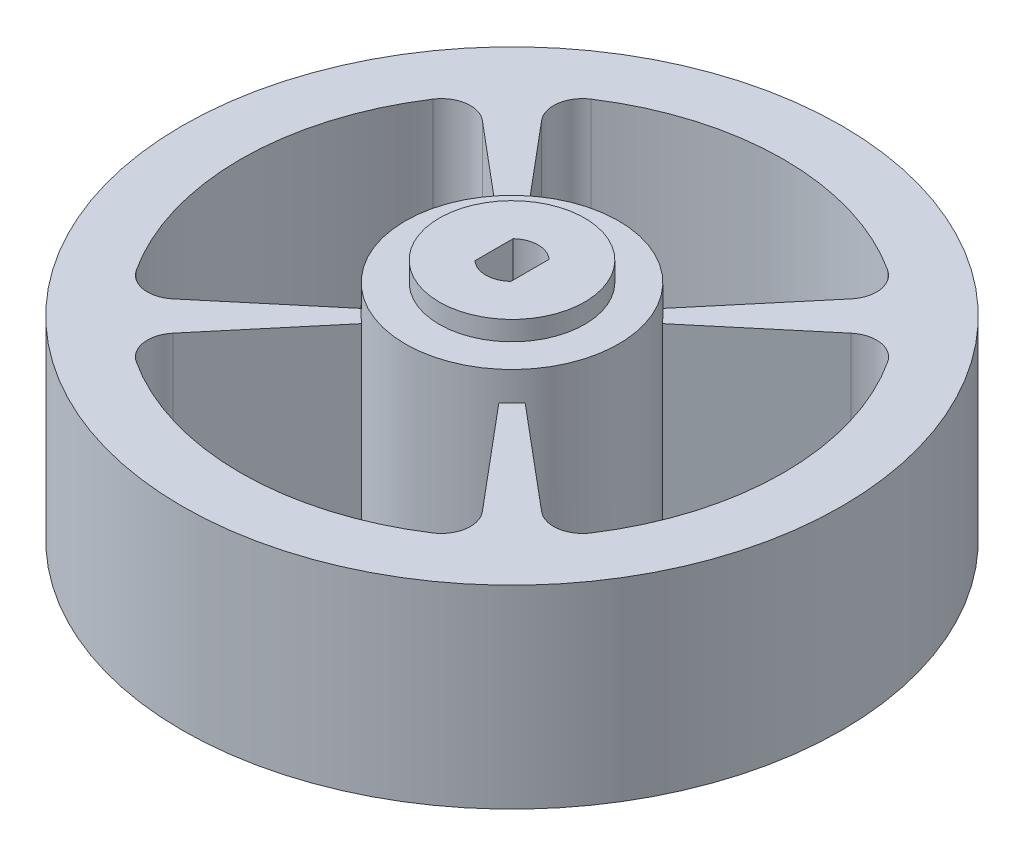
ISO-10303-21;
HEADER;
FILE_DESCRIPTION(('STEP AP214'),'2;1');
FILE_NAME('part.step','',(''),(''),'','','');
FILE_SCHEMA(('AUTOMOTIVE_DESIGN { 1 0 10303 214 1 1 1 1 }'));
ENDSEC;
DATA;
#1=APPLICATION_CONTEXT('core data for automotive mechanical design processes');
#2=APPLICATION_PROTOCOL_DEFINITION('international standard','automotive_design',2000,#1);
#3=PRODUCT_CONTEXT('',#1,'mechanical');
#4=PRODUCT('Part','Part','',(#3));
#5=PRODUCT_RELATED_PRODUCT_CATEGORY('part','',(#4));
#6=PRODUCT_DEFINITION_FORMATION('','',#4);
#7=PRODUCT_DEFINITION_CONTEXT('part definition',#1,'design');
#8=PRODUCT_DEFINITION('design','',#6,#7);
#9=PRODUCT_DEFINITION_SHAPE('','',#8);
#10=(LENGTH_UNIT() NAMED_UNIT(*) SI_UNIT(.MILLI.,.METRE.));
#11=(NAMED_UNIT(*) PLANE_ANGLE_UNIT() SI_UNIT($,.RADIAN.));
#12=(NAMED_UNIT(*) SI_UNIT($,.STERADIAN.) SOLID_ANGLE_UNIT());
#13=UNCERTAINTY_MEASURE_WITH_UNIT(LENGTH_MEASURE(1.E-05),#10,'distance_accuracy_value','');
#14=(GEOMETRIC_REPRESENTATION_CONTEXT(3) GLOBAL_UNCERTAINTY_ASSIGNED_CONTEXT((#13)) GLOBAL_UNIT_ASSIGNED_CONTEXT((#10,
#11,#12)) REPRESENTATION_CONTEXT('',''));
#15=CARTESIAN_POINT('',(0.,0.,0.));
#16=DIRECTION('',(0.,0.,1.));
#17=DIRECTION('',(1.,0.,0.));
#18=AXIS2_PLACEMENT_3D('',#15,#16,#17);
#19=CARTESIAN_POINT('',(0.,10.,0.));
#20=DIRECTION('',(0.,-1.,0.));
#21=DIRECTION('',(0.,0.,-1.));
#22=AXIS2_PLACEMENT_3D('',#19,#20,#21);
#23=CYLINDRICAL_SURFACE('',#22,34.);
#24=CARTESIAN_POINT('',(0.,10.,0.));
#25=DIRECTION('',(0.,1.,0.));
#26=DIRECTION('',(0.,0.,1.));
#27=AXIS2_PLACEMENT_3D('',#24,#25,#26);
#28=CIRCLE('',#27,34.);
#29=CARTESIAN_POINT('',(0.,10.,34.));
#30=VERTEX_POINT('',#29);
#31=EDGE_CURVE('E11',#30,#30,#28,.T.);
#32=ORIENTED_EDGE('',*,*,#31,.F.);
#33=EDGE_LOOP('',(#32));
#34=FACE_BOUND('',#33,.T.);
#35=CARTESIAN_POINT('',(0.,-10.,0.));
#36=DIRECTION('',(0.,1.,0.));
#37=DIRECTION('',(0.,0.,1.));
#38=AXIS2_PLACEMENT_3D('',#35,#36,#37);
#39=CIRCLE('',#38,34.);
#40=CARTESIAN_POINT('',(0.,-10.,34.));
#41=VERTEX_POINT('',#40);
#42=EDGE_CURVE('E44',#41,#41,#39,.T.);
#43=ORIENTED_EDGE('',*,*,#42,.T.);
#44=EDGE_LOOP('',(#43));
#45=FACE_BOUND('',#44,.T.);
#46=ADVANCED_FACE('F41',(#34,#45),#23,.T.);
#47=CARTESIAN_POINT('',(0.,10.,0.));
#48=DIRECTION('',(0.,1.,0.));
#49=DIRECTION('',(0.,0.,1.));
#50=AXIS2_PLACEMENT_3D('',#47,#48,#49);
#51=PLANE('',#50);
#52=DIRECTION('',(-0.642787609686536,0.,-0.766044443118981));
#53=VECTOR('',#52,1.);
#54=CARTESIAN_POINT('',(7.07066370655189,10.,8.42648887430879));
#55=LINE('',#54,#53);
#56=CARTESIAN_POINT('',(15.9535689197929,10.,19.0127230748627));
#57=VERTEX_POINT('',#56);
#58=CARTESIAN_POINT('',(7.07066370655189,10.,8.42648887430879));
#59=VERTEX_POINT('',#58);
#60=EDGE_CURVE('E294',#57,#59,#55,.T.);
#61=ORIENTED_EDGE('',*,*,#60,.F.);
#62=CARTESIAN_POINT('',(13.655435590436,10.,20.9410859039223));
#63=DIRECTION('',(0.,1.,0.));
#64=DIRECTION('',(0.,0.,-1.));
#65=AXIS2_PLACEMENT_3D('',#62,#63,#64);
#66=CIRCLE('',#65,3.);
#67=CARTESIAN_POINT('',(15.2940878612883,10.,23.454016212393));
#68=VERTEX_POINT('',#67);
#69=EDGE_CURVE('E296',#68,#57,#66,.T.);
#70=ORIENTED_EDGE('',*,*,#69,.F.);
#71=CARTESIAN_POINT('',(0.,10.,0.));
#72=DIRECTION('',(0.,1.,0.));
#73=DIRECTION('',(0.,0.,1.));
#74=AXIS2_PLACEMENT_3D('',#71,#72,#73);
#75=CIRCLE('',#74,28.);
#76=CARTESIAN_POINT('',(-15.2940878612886,10.,23.4540162123928));
#77=VERTEX_POINT('',#76);
#78=EDGE_CURVE('E300',#77,#68,#75,.T.);
#79=ORIENTED_EDGE('',*,*,#78,.F.);
#80=CARTESIAN_POINT('',(-13.6554355904363,10.,20.9410859039222));
#81=DIRECTION('',(0.,1.,0.));
#82=DIRECTION('',(0.,0.,1.));
#83=AXIS2_PLACEMENT_3D('',#80,#81,#82);
#84=CIRCLE('',#83,3.);
#85=CARTESIAN_POINT('',(-15.9535689197932,10.,19.0127230748625));
#86=VERTEX_POINT('',#85);
#87=EDGE_CURVE('E303',#86,#77,#84,.T.);
#88=ORIENTED_EDGE('',*,*,#87,.F.);
#89=DIRECTION('',(-0.642787609686546,0.,0.766044443118973));
#90=VECTOR('',#89,1.);
#91=CARTESIAN_POINT('',(-7.070663706552,10.,8.4264888743087));
#92=LINE('',#91,#90);
#93=CARTESIAN_POINT('',(-7.070663706552,10.,8.4264888743087));
#94=VERTEX_POINT('',#93);
#95=EDGE_CURVE('E306',#94,#86,#92,.T.);
#96=ORIENTED_EDGE('',*,*,#95,.F.);
#97=CARTESIAN_POINT('',(0.,10.,0.));
#98=DIRECTION('',(0.,1.,0.));
#99=DIRECTION('',(0.,0.,1.));
#100=AXIS2_PLACEMENT_3D('',#97,#98,#99);
#101=CIRCLE('',#100,11.);
#102=CARTESIAN_POINT('',(-8.42648887430882,10.,7.07066370655186));
#103=VERTEX_POINT('',#102);
#104=EDGE_CURVE('E253',#103,#94,#101,.T.);
#105=ORIENTED_EDGE('',*,*,#104,.F.);
#106=DIRECTION('',(0.766044443118983,0.,-0.642787609686533));
#107=VECTOR('',#106,1.);
#108=CARTESIAN_POINT('',(-8.42648887430882,10.,7.07066370655186));
#109=LINE('',#108,#107);
#110=CARTESIAN_POINT('',(-19.0127230748628,10.,15.9535689197929));
#111=VERTEX_POINT('',#110);
#112=EDGE_CURVE('E229',#111,#103,#109,.T.);
#113=ORIENTED_EDGE('',*,*,#112,.F.);
#114=CARTESIAN_POINT('',(-20.9410859039224,10.,13.6554355904359));
#115=DIRECTION('',(0.,1.,0.));
#116=DIRECTION('',(0.,0.,-1.));
#117=AXIS2_PLACEMENT_3D('',#114,#115,#116);
#118=CIRCLE('',#117,3.);
#119=CARTESIAN_POINT('',(-23.4540162123931,10.,15.2940878612882));
#120=VERTEX_POINT('',#119);
#121=EDGE_CURVE('E240',#120,#111,#118,.T.);
#122=ORIENTED_EDGE('',*,*,#121,.F.);
#123=CARTESIAN_POINT('',(0.,10.,0.));
#124=DIRECTION('',(0.,1.,0.));
#125=DIRECTION('',(0.,0.,1.));
#126=AXIS2_PLACEMENT_3D('',#123,#124,#125);
#127=CIRCLE('',#126,28.);
#128=CARTESIAN_POINT('',(-23.4540162123928,10.,-15.2940878612887));
#129=VERTEX_POINT('',#128);
#130=EDGE_CURVE('E245',#129,#120,#127,.T.);
#131=ORIENTED_EDGE('',*,*,#130,.F.);
#132=CARTESIAN_POINT('',(-20.9410859039221,10.,-13.6554355904363));
#133=DIRECTION('',(0.,1.,0.));
#134=DIRECTION('',(0.,0.,1.));
#135=AXIS2_PLACEMENT_3D('',#132,#133,#134);
#136=CIRCLE('',#135,3.);
#137=CARTESIAN_POINT('',(-19.0127230748625,10.,-15.9535689197932));
#138=VERTEX_POINT('',#137);
#139=EDGE_CURVE('E262',#138,#129,#136,.T.);
#140=ORIENTED_EDGE('',*,*,#139,.F.);
#141=DIRECTION('',(-0.76604444311897,0.,-0.642787609686548));
#142=VECTOR('',#141,1.);
#143=CARTESIAN_POINT('',(-8.42648887430867,10.,-7.07066370655203));
#144=LINE('',#143,#142);
#145=CARTESIAN_POINT('',(-8.42648887430867,10.,-7.07066370655203));
#146=VERTEX_POINT('',#145);
#147=EDGE_CURVE('E265',#146,#138,#144,.T.);
#148=ORIENTED_EDGE('',*,*,#147,.F.);
#149=CARTESIAN_POINT('',(-7.07066370655195,10.,-8.42648887430874));
#150=VERTEX_POINT('',#149);
#151=EDGE_CURVE('E454',#150,#146,#101,.T.);
#152=ORIENTED_EDGE('',*,*,#151,.F.);
#153=DIRECTION('',(0.642787609686541,0.,0.766044443118977));
#154=VECTOR('',#153,1.);
#155=CARTESIAN_POINT('',(-7.07066370655195,10.,-8.42648887430874));
#156=LINE('',#155,#154);
#157=CARTESIAN_POINT('',(-15.9535689197931,10.,-19.0127230748626));
#158=VERTEX_POINT('',#157);
#159=EDGE_CURVE('E371',#158,#150,#156,.T.);
#160=ORIENTED_EDGE('',*,*,#159,.F.);
#161=CARTESIAN_POINT('',(-13.6554355904361,10.,-20.9410859039222));
#162=DIRECTION('',(0.,1.,0.));
#163=DIRECTION('',(0.,0.,-1.));
#164=AXIS2_PLACEMENT_3D('',#161,#162,#163);
#165=CIRCLE('',#164,3.);
#166=CARTESIAN_POINT('',(-15.2940878612885,10.,-23.4540162123929));
#167=VERTEX_POINT('',#166);
#168=EDGE_CURVE('E395',#167,#158,#165,.T.);
#169=ORIENTED_EDGE('',*,*,#168,.F.);
#170=CARTESIAN_POINT('',(0.,10.,0.));
#171=DIRECTION('',(0.,1.,0.));
#172=DIRECTION('',(0.,0.,1.));
#173=AXIS2_PLACEMENT_3D('',#170,#171,#172);
#174=CIRCLE('',#173,28.);
#175=CARTESIAN_POINT('',(15.2940878612884,10.,-23.4540162123929));
#176=VERTEX_POINT('',#175);
#177=EDGE_CURVE('E392',#176,#167,#174,.T.);
#178=ORIENTED_EDGE('',*,*,#177,.F.);
#179=CARTESIAN_POINT('',(13.6554355904361,10.,-20.9410859039222));
#180=DIRECTION('',(0.,1.,0.));
#181=DIRECTION('',(0.,0.,1.));
#182=AXIS2_PLACEMENT_3D('',#179,#180,#181);
#183=CIRCLE('',#182,3.);
#184=CARTESIAN_POINT('',(15.953568919793,10.,-19.0127230748626));
#185=VERTEX_POINT('',#184);
#186=EDGE_CURVE('E389',#185,#176,#183,.T.);
#187=ORIENTED_EDGE('',*,*,#186,.F.);
#188=DIRECTION('',(0.642787609686541,0.,-0.766044443118977));
#189=VECTOR('',#188,1.);
#190=CARTESIAN_POINT('',(7.07066370655194,10.,-8.42648887430875));
#191=LINE('',#190,#189);
#192=CARTESIAN_POINT('',(7.07066370655194,10.,-8.42648887430875));
#193=VERTEX_POINT('',#192);
#194=EDGE_CURVE('E352',#193,#185,#191,.T.);
#195=ORIENTED_EDGE('',*,*,#194,.F.);
#196=CARTESIAN_POINT('',(8.42648887430876,10.,-7.07066370655192));
#197=VERTEX_POINT('',#196);
#198=EDGE_CURVE('E450',#197,#193,#101,.T.);
#199=ORIENTED_EDGE('',*,*,#198,.F.);
#200=DIRECTION('',(-0.766044443118979,0.,0.642787609686538));
#201=VECTOR('',#200,1.);
#202=CARTESIAN_POINT('',(8.42648887430876,10.,-7.07066370655192));
#203=LINE('',#202,#201);
#204=CARTESIAN_POINT('',(19.0127230748627,10.,-15.953568919793));
#205=VERTEX_POINT('',#204);
#206=EDGE_CURVE('E337',#205,#197,#203,.T.);
#207=ORIENTED_EDGE('',*,*,#206,.F.);
#208=CARTESIAN_POINT('',(20.9410859039223,10.,-13.6554355904361));
#209=DIRECTION('',(0.,1.,0.));
#210=DIRECTION('',(0.,0.,-1.));
#211=AXIS2_PLACEMENT_3D('',#208,#209,#210);
#212=CIRCLE('',#211,3.);
#213=CARTESIAN_POINT('',(23.454016212393,10.,-15.2940878612884));
#214=VERTEX_POINT('',#213);
#215=EDGE_CURVE('E339',#214,#205,#212,.T.);
#216=ORIENTED_EDGE('',*,*,#215,.F.);
#217=CARTESIAN_POINT('',(0.,10.,0.));
#218=DIRECTION('',(0.,1.,0.));
#219=DIRECTION('',(0.,0.,1.));
#220=AXIS2_PLACEMENT_3D('',#217,#218,#219);
#221=CIRCLE('',#220,28.);
#222=CARTESIAN_POINT('',(23.4540162123929,10.,15.2940878612885));
#223=VERTEX_POINT('',#222);
#224=EDGE_CURVE('E343',#223,#214,#221,.T.);
#225=ORIENTED_EDGE('',*,*,#224,.F.);
#226=CARTESIAN_POINT('',(20.9410859039222,10.,13.6554355904362));
#227=DIRECTION('',(0.,1.,0.));
#228=DIRECTION('',(0.,0.,1.));
#229=AXIS2_PLACEMENT_3D('',#226,#227,#228);
#230=CIRCLE('',#229,3.);
#231=CARTESIAN_POINT('',(19.0127230748626,10.,15.9535689197931));
#232=VERTEX_POINT('',#231);
#233=EDGE_CURVE('E346',#232,#223,#230,.T.);
#234=ORIENTED_EDGE('',*,*,#233,.F.);
#235=DIRECTION('',(0.766044443118975,0.,0.642787609686543));
#236=VECTOR('',#235,1.);
#237=CARTESIAN_POINT('',(8.42648887430872,10.,7.07066370655197));
#238=LINE('',#237,#236);
#239=CARTESIAN_POINT('',(8.42648887430872,10.,7.07066370655197));
#240=VERTEX_POINT('',#239);
#241=EDGE_CURVE('E349',#240,#232,#238,.T.);
#242=ORIENTED_EDGE('',*,*,#241,.F.);
#243=EDGE_CURVE('E49',#59,#240,#101,.T.);
#244=ORIENTED_EDGE('',*,*,#243,.F.);
#245=EDGE_LOOP('',(#61,#70,#79,#88,#96,#105,#113,#122,#131,#140,#148,#152,#160,#169,#178,#187,
#195,#199,#207,#216,#225,#234,#242,#244));
#246=FACE_BOUND('',#245,.T.);
#247=ORIENTED_EDGE('',*,*,#31,.T.);
#248=EDGE_LOOP('',(#247));
#249=FACE_BOUND('',#248,.T.);
#250=ADVANCED_FACE('F249',(#246,#249),#51,.T.);
#251=CARTESIAN_POINT('',(0.,-10.,0.));
#252=DIRECTION('',(0.,1.,0.));
#253=DIRECTION('',(0.,0.,1.));
#254=AXIS2_PLACEMENT_3D('',#251,#252,#253);
#255=PLANE('',#254);
#256=DIRECTION('',(-0.642787609686536,0.,-0.766044443118981));
#257=VECTOR('',#256,1.);
#258=CARTESIAN_POINT('',(7.07066370655189,-10.,8.42648887430879));
#259=LINE('',#258,#257);
#260=CARTESIAN_POINT('',(15.9535689197929,-10.,19.0127230748627));
#261=VERTEX_POINT('',#260);
#262=CARTESIAN_POINT('',(7.07066370655189,-10.,8.42648887430879));
#263=VERTEX_POINT('',#262);
#264=EDGE_CURVE('E283',#261,#263,#259,.T.);
#265=ORIENTED_EDGE('',*,*,#264,.T.);
#266=CARTESIAN_POINT('',(0.,-10.,0.));
#267=DIRECTION('',(0.,-1.,0.));
#268=DIRECTION('',(0.,0.,1.));
#269=AXIS2_PLACEMENT_3D('',#266,#267,#268);
#270=CIRCLE('',#269,11.);
#271=CARTESIAN_POINT('',(-7.070663706552,-10.,8.4264888743087));
#272=VERTEX_POINT('',#271);
#273=EDGE_CURVE('E297',#263,#272,#270,.T.);
#274=ORIENTED_EDGE('',*,*,#273,.T.);
#275=DIRECTION('',(-0.642787609686546,0.,0.766044443118973));
#276=VECTOR('',#275,1.);
#277=CARTESIAN_POINT('',(-7.070663706552,-10.,8.4264888743087));
#278=LINE('',#277,#276);
#279=CARTESIAN_POINT('',(-15.9535689197932,-10.,19.0127230748625));
#280=VERTEX_POINT('',#279);
#281=EDGE_CURVE('E319',#272,#280,#278,.T.);
#282=ORIENTED_EDGE('',*,*,#281,.T.);
#283=CARTESIAN_POINT('',(-13.6554355904363,-10.,20.9410859039222));
#284=DIRECTION('',(0.,1.,0.));
#285=DIRECTION('',(0.,0.,1.));
#286=AXIS2_PLACEMENT_3D('',#283,#284,#285);
#287=CIRCLE('',#286,3.);
#288=CARTESIAN_POINT('',(-15.2940878612886,-10.,23.4540162123928));
#289=VERTEX_POINT('',#288);
#290=EDGE_CURVE('E56',#280,#289,#287,.T.);
#291=ORIENTED_EDGE('',*,*,#290,.T.);
#292=CARTESIAN_POINT('',(0.,-10.,0.));
#293=DIRECTION('',(0.,1.,0.));
#294=DIRECTION('',(0.,0.,1.));
#295=AXIS2_PLACEMENT_3D('',#292,#293,#294);
#296=CIRCLE('',#295,28.);
#297=CARTESIAN_POINT('',(15.2940878612883,-10.,23.454016212393));
#298=VERTEX_POINT('',#297);
#299=EDGE_CURVE('E315',#289,#298,#296,.T.);
#300=ORIENTED_EDGE('',*,*,#299,.T.);
#301=CARTESIAN_POINT('',(13.655435590436,-10.,20.9410859039223));
#302=DIRECTION('',(0.,1.,0.));
#303=DIRECTION('',(0.,0.,-1.));
#304=AXIS2_PLACEMENT_3D('',#301,#302,#303);
#305=CIRCLE('',#304,3.);
#306=EDGE_CURVE('E312',#298,#261,#305,.T.);
#307=ORIENTED_EDGE('',*,*,#306,.T.);
#308=EDGE_LOOP('',(#265,#274,#282,#291,#300,#307));
#309=FACE_BOUND('',#308,.T.);
#310=DIRECTION('',(-0.766044443118979,0.,0.642787609686538));
#311=VECTOR('',#310,1.);
#312=CARTESIAN_POINT('',(8.42648887430876,-10.,-7.07066370655192));
#313=LINE('',#312,#311);
#314=CARTESIAN_POINT('',(19.0127230748627,-10.,-15.953568919793));
#315=VERTEX_POINT('',#314);
#316=CARTESIAN_POINT('',(8.42648887430876,-10.,-7.07066370655192));
#317=VERTEX_POINT('',#316);
#318=EDGE_CURVE('E326',#315,#317,#313,.T.);
#319=ORIENTED_EDGE('',*,*,#318,.T.);
#320=CARTESIAN_POINT('',(0.,-10.,0.));
#321=DIRECTION('',(0.,-1.,0.));
#322=DIRECTION('',(0.,0.,1.));
#323=AXIS2_PLACEMENT_3D('',#320,#321,#322);
#324=CIRCLE('',#323,11.);
#325=CARTESIAN_POINT('',(8.42648887430872,-10.,7.07066370655197));
#326=VERTEX_POINT('',#325);
#327=EDGE_CURVE('E340',#317,#326,#324,.T.);
#328=ORIENTED_EDGE('',*,*,#327,.T.);
#329=DIRECTION('',(0.766044443118975,0.,0.642787609686543));
#330=VECTOR('',#329,1.);
#331=CARTESIAN_POINT('',(8.42648887430872,-10.,7.07066370655197));
#332=LINE('',#331,#330);
#333=CARTESIAN_POINT('',(19.0127230748626,-10.,15.9535689197931));
#334=VERTEX_POINT('',#333);
#335=EDGE_CURVE('E362',#326,#334,#332,.T.);
#336=ORIENTED_EDGE('',*,*,#335,.T.);
#337=CARTESIAN_POINT('',(20.9410859039222,-10.,13.6554355904362));
#338=DIRECTION('',(0.,1.,0.));
#339=DIRECTION('',(0.,0.,1.));
#340=AXIS2_PLACEMENT_3D('',#337,#338,#339);
#341=CIRCLE('',#340,3.);
#342=CARTESIAN_POINT('',(23.4540162123929,-10.,15.2940878612885));
#343=VERTEX_POINT('',#342);
#344=EDGE_CURVE('E64',#334,#343,#341,.T.);
#345=ORIENTED_EDGE('',*,*,#344,.T.);
#346=CARTESIAN_POINT('',(0.,-10.,0.));
#347=DIRECTION('',(0.,1.,0.));
#348=DIRECTION('',(0.,0.,1.));
#349=AXIS2_PLACEMENT_3D('',#346,#347,#348);
#350=CIRCLE('',#349,28.);
#351=CARTESIAN_POINT('',(23.454016212393,-10.,-15.2940878612884));
#352=VERTEX_POINT('',#351);
#353=EDGE_CURVE('E358',#343,#352,#350,.T.);
#354=ORIENTED_EDGE('',*,*,#353,.T.);
#355=CARTESIAN_POINT('',(20.9410859039223,-10.,-13.6554355904361));
#356=DIRECTION('',(0.,1.,0.));
#357=DIRECTION('',(0.,0.,-1.));
#358=AXIS2_PLACEMENT_3D('',#355,#356,#357);
#359=CIRCLE('',#358,3.);
#360=EDGE_CURVE('E355',#352,#315,#359,.T.);
#361=ORIENTED_EDGE('',*,*,#360,.T.);
#362=EDGE_LOOP('',(#319,#328,#336,#345,#354,#361));
#363=FACE_BOUND('',#362,.T.);
#364=DIRECTION('',(0.766044443118983,0.,-0.642787609686533));
#365=VECTOR('',#364,1.);
#366=CARTESIAN_POINT('',(-8.42648887430882,-10.,7.07066370655186));
#367=LINE('',#366,#365);
#368=CARTESIAN_POINT('',(-19.0127230748628,-10.,15.9535689197929));
#369=VERTEX_POINT('',#368);
#370=CARTESIAN_POINT('',(-8.42648887430882,-10.,7.07066370655186));
#371=VERTEX_POINT('',#370);
#372=EDGE_CURVE('E232',#369,#371,#367,.T.);
#373=ORIENTED_EDGE('',*,*,#372,.T.);
#374=CARTESIAN_POINT('',(0.,-10.,0.));
#375=DIRECTION('',(0.,-1.,0.));
#376=DIRECTION('',(0.,0.,1.));
#377=AXIS2_PLACEMENT_3D('',#374,#375,#376);
#378=CIRCLE('',#377,11.);
#379=CARTESIAN_POINT('',(-8.42648887430867,-10.,-7.07066370655203));
#380=VERTEX_POINT('',#379);
#381=EDGE_CURVE('E254',#371,#380,#378,.T.);
#382=ORIENTED_EDGE('',*,*,#381,.T.);
#383=DIRECTION('',(-0.76604444311897,0.,-0.642787609686548));
#384=VECTOR('',#383,1.);
#385=CARTESIAN_POINT('',(-8.42648887430867,-10.,-7.07066370655203));
#386=LINE('',#385,#384);
#387=CARTESIAN_POINT('',(-19.0127230748625,-10.,-15.9535689197932));
#388=VERTEX_POINT('',#387);
#389=EDGE_CURVE('E257',#380,#388,#386,.T.);
#390=ORIENTED_EDGE('',*,*,#389,.T.);
#391=CARTESIAN_POINT('',(-20.9410859039221,-10.,-13.6554355904363));
#392=DIRECTION('',(0.,1.,0.));
#393=DIRECTION('',(0.,0.,1.));
#394=AXIS2_PLACEMENT_3D('',#391,#392,#393);
#395=CIRCLE('',#394,3.);
#396=CARTESIAN_POINT('',(-23.4540162123928,-10.,-15.2940878612887));
#397=VERTEX_POINT('',#396);
#398=EDGE_CURVE('E276',#388,#397,#395,.T.);
#399=ORIENTED_EDGE('',*,*,#398,.T.);
#400=CARTESIAN_POINT('',(0.,-10.,0.));
#401=DIRECTION('',(0.,1.,0.));
#402=DIRECTION('',(0.,0.,1.));
#403=AXIS2_PLACEMENT_3D('',#400,#401,#402);
#404=CIRCLE('',#403,28.);
#405=CARTESIAN_POINT('',(-23.4540162123931,-10.,15.2940878612882));
#406=VERTEX_POINT('',#405);
#407=EDGE_CURVE('E273',#397,#406,#404,.T.);
#408=ORIENTED_EDGE('',*,*,#407,.T.);
#409=CARTESIAN_POINT('',(-20.9410859039224,-10.,13.6554355904359));
#410=DIRECTION('',(0.,1.,0.));
#411=DIRECTION('',(0.,0.,-1.));
#412=AXIS2_PLACEMENT_3D('',#409,#410,#411);
#413=CIRCLE('',#412,3.);
#414=EDGE_CURVE('E270',#406,#369,#413,.T.);
#415=ORIENTED_EDGE('',*,*,#414,.T.);
#416=EDGE_LOOP('',(#373,#382,#390,#399,#408,#415));
#417=FACE_BOUND('',#416,.T.);
#418=DIRECTION('',(0.642787609686541,0.,0.766044443118977));
#419=VECTOR('',#418,1.);
#420=CARTESIAN_POINT('',(-7.07066370655195,-10.,-8.42648887430874));
#421=LINE('',#420,#419);
#422=CARTESIAN_POINT('',(-15.9535689197931,-10.,-19.0127230748626));
#423=VERTEX_POINT('',#422);
#424=CARTESIAN_POINT('',(-7.07066370655195,-10.,-8.42648887430874));
#425=VERTEX_POINT('',#424);
#426=EDGE_CURVE('E383',#423,#425,#421,.T.);
#427=ORIENTED_EDGE('',*,*,#426,.T.);
#428=CARTESIAN_POINT('',(0.,-10.,0.));
#429=DIRECTION('',(0.,-1.,0.));
#430=DIRECTION('',(0.,0.,1.));
#431=AXIS2_PLACEMENT_3D('',#428,#429,#430);
#432=CIRCLE('',#431,11.);
#433=CARTESIAN_POINT('',(7.07066370655194,-10.,-8.42648887430875));
#434=VERTEX_POINT('',#433);
#435=EDGE_CURVE('E367',#425,#434,#432,.T.);
#436=ORIENTED_EDGE('',*,*,#435,.T.);
#437=DIRECTION('',(0.642787609686541,0.,-0.766044443118977));
#438=VECTOR('',#437,1.);
#439=CARTESIAN_POINT('',(7.07066370655194,-10.,-8.42648887430875));
#440=LINE('',#439,#438);
#441=CARTESIAN_POINT('',(15.953568919793,-10.,-19.0127230748626));
#442=VERTEX_POINT('',#441);
#443=EDGE_CURVE('E370',#434,#442,#440,.T.);
#444=ORIENTED_EDGE('',*,*,#443,.T.);
#445=CARTESIAN_POINT('',(13.6554355904361,-10.,-20.9410859039222));
#446=DIRECTION('',(0.,1.,0.));
#447=DIRECTION('',(0.,0.,1.));
#448=AXIS2_PLACEMENT_3D('',#445,#446,#447);
#449=CIRCLE('',#448,3.);
#450=CARTESIAN_POINT('',(15.2940878612884,-10.,-23.4540162123929));
#451=VERTEX_POINT('',#450);
#452=EDGE_CURVE('E374',#442,#451,#449,.T.);
#453=ORIENTED_EDGE('',*,*,#452,.T.);
#454=CARTESIAN_POINT('',(0.,-10.,0.));
#455=DIRECTION('',(0.,1.,0.));
#456=DIRECTION('',(0.,0.,1.));
#457=AXIS2_PLACEMENT_3D('',#454,#455,#456);
#458=CIRCLE('',#457,28.);
#459=CARTESIAN_POINT('',(-15.2940878612885,-10.,-23.4540162123929));
#460=VERTEX_POINT('',#459);
#461=EDGE_CURVE('E377',#451,#460,#458,.T.);
#462=ORIENTED_EDGE('',*,*,#461,.T.);
#463=CARTESIAN_POINT('',(-13.6554355904361,-10.,-20.9410859039222));
#464=DIRECTION('',(0.,1.,0.));
#465=DIRECTION('',(0.,0.,-1.));
#466=AXIS2_PLACEMENT_3D('',#463,#464,#465);
#467=CIRCLE('',#466,3.);
#468=EDGE_CURVE('E380',#460,#423,#467,.T.);
#469=ORIENTED_EDGE('',*,*,#468,.T.);
#470=EDGE_LOOP('',(#427,#436,#444,#453,#462,#469));
#471=FACE_BOUND('',#470,.T.);
#472=ORIENTED_EDGE('',*,*,#42,.F.);
#473=EDGE_LOOP('',(#472));
#474=FACE_BOUND('',#473,.T.);
#475=DIRECTION('',(0.,0.,-1.));
#476=VECTOR('',#475,1.);
#477=CARTESIAN_POINT('',(1.85,-10.,0.));
#478=LINE('',#477,#476);
#479=CARTESIAN_POINT('',(1.85,-10.,1.96659604392972));
#480=VERTEX_POINT('',#479);
#481=CARTESIAN_POINT('',(1.85,-10.,-1.96659604392972));
#482=VERTEX_POINT('',#481);
#483=EDGE_CURVE('E415',#480,#482,#478,.T.);
#484=ORIENTED_EDGE('',*,*,#483,.T.);
#485=CARTESIAN_POINT('',(0.,-10.,0.));
#486=DIRECTION('',(0.,1.,0.));
#487=DIRECTION('',(0.,0.,1.));
#488=AXIS2_PLACEMENT_3D('',#485,#486,#487);
#489=CIRCLE('',#488,2.7);
#490=CARTESIAN_POINT('',(-1.85,-10.,-1.96659604392972));
#491=VERTEX_POINT('',#490);
#492=EDGE_CURVE('E414',#491,#482,#489,.F.);
#493=ORIENTED_EDGE('',*,*,#492,.F.);
#494=DIRECTION('',(0.,0.,-1.));
#495=VECTOR('',#494,1.);
#496=CARTESIAN_POINT('',(-1.85,-10.,0.));
#497=LINE('',#496,#495);
#498=CARTESIAN_POINT('',(-1.85,-10.,1.96659604392972));
#499=VERTEX_POINT('',#498);
#500=EDGE_CURVE('E419',#499,#491,#497,.T.);
#501=ORIENTED_EDGE('',*,*,#500,.F.);
#502=CARTESIAN_POINT('',(0.,-10.,0.));
#503=DIRECTION('',(0.,1.,0.));
#504=DIRECTION('',(0.,0.,1.));
#505=AXIS2_PLACEMENT_3D('',#502,#503,#504);
#506=CIRCLE('',#505,2.7);
#507=EDGE_CURVE('E402',#480,#499,#506,.F.);
#508=ORIENTED_EDGE('',*,*,#507,.F.);
#509=EDGE_LOOP('',(#484,#493,#501,#508));
#510=FACE_BOUND('',#509,.T.);
#511=ADVANCED_FACE('F460',(#309,#363,#417,#471,#474,#510),#255,.F.);
#512=CARTESIAN_POINT('',(0.,13.,0.));
#513=DIRECTION('',(0.,-1.,0.));
#514=DIRECTION('',(0.,0.,-1.));
#515=AXIS2_PLACEMENT_3D('',#512,#513,#514);
#516=CYLINDRICAL_SURFACE('',#515,11.);
#517=ORIENTED_EDGE('',*,*,#243,.T.);
#518=DIRECTION('',(0.,1.,0.));
#519=VECTOR('',#518,1.);
#520=CARTESIAN_POINT('',(8.42648887430872,-10.,7.07066370655197));
#521=LINE('',#520,#519);
#522=EDGE_CURVE('E324',#326,#240,#521,.T.);
#523=ORIENTED_EDGE('',*,*,#522,.F.);
#524=ORIENTED_EDGE('',*,*,#327,.F.);
#525=DIRECTION('',(0.,1.,0.));
#526=VECTOR('',#525,1.);
#527=CARTESIAN_POINT('',(8.42648887430876,-10.,-7.07066370655192));
#528=LINE('',#527,#526);
#529=EDGE_CURVE('E309',#317,#197,#528,.T.);
#530=ORIENTED_EDGE('',*,*,#529,.T.);
#531=ORIENTED_EDGE('',*,*,#198,.T.);
#532=DIRECTION('',(0.,1.,0.));
#533=VECTOR('',#532,1.);
#534=CARTESIAN_POINT('',(7.07066370655194,-10.,-8.42648887430875));
#535=LINE('',#534,#533);
#536=EDGE_CURVE('E386',#434,#193,#535,.T.);
#537=ORIENTED_EDGE('',*,*,#536,.F.);
#538=ORIENTED_EDGE('',*,*,#435,.F.);
#539=DIRECTION('',(0.,1.,0.));
#540=VECTOR('',#539,1.);
#541=CARTESIAN_POINT('',(-7.07066370655195,-10.,-8.42648887430874));
#542=LINE('',#541,#540);
#543=EDGE_CURVE('E399',#425,#150,#542,.T.);
#544=ORIENTED_EDGE('',*,*,#543,.T.);
#545=ORIENTED_EDGE('',*,*,#151,.T.);
#546=DIRECTION('',(0.,1.,0.));
#547=VECTOR('',#546,1.);
#548=CARTESIAN_POINT('',(-8.42648887430867,-10.,-7.07066370655203));
#549=LINE('',#548,#547);
#550=EDGE_CURVE('E271',#380,#146,#549,.T.);
#551=ORIENTED_EDGE('',*,*,#550,.F.);
#552=ORIENTED_EDGE('',*,*,#381,.F.);
#553=DIRECTION('',(0.,1.,0.));
#554=VECTOR('',#553,1.);
#555=CARTESIAN_POINT('',(-8.42648887430882,-10.,7.07066370655186));
#556=LINE('',#555,#554);
#557=EDGE_CURVE('E237',#371,#103,#556,.T.);
#558=ORIENTED_EDGE('',*,*,#557,.T.);
#559=ORIENTED_EDGE('',*,*,#104,.T.);
#560=DIRECTION('',(0.,1.,0.));
#561=VECTOR('',#560,1.);
#562=CARTESIAN_POINT('',(-7.070663706552,-10.,8.4264888743087));
#563=LINE('',#562,#561);
#564=EDGE_CURVE('E281',#272,#94,#563,.T.);
#565=ORIENTED_EDGE('',*,*,#564,.F.);
#566=ORIENTED_EDGE('',*,*,#273,.F.);
#567=DIRECTION('',(0.,1.,0.));
#568=VECTOR('',#567,1.);
#569=CARTESIAN_POINT('',(7.07066370655189,-10.,8.42648887430879));
#570=LINE('',#569,#568);
#571=EDGE_CURVE('E268',#263,#59,#570,.T.);
#572=ORIENTED_EDGE('',*,*,#571,.T.);
#573=EDGE_LOOP('',(#517,#523,#524,#530,#531,#537,#538,#544,#545,#551,#552,#558,#559,#565,#566,#572));
#574=FACE_BOUND('',#573,.T.);
#575=CARTESIAN_POINT('',(0.,13.,0.));
#576=DIRECTION('',(0.,1.,0.));
#577=DIRECTION('',(0.,0.,1.));
#578=AXIS2_PLACEMENT_3D('',#575,#576,#577);
#579=CIRCLE('',#578,11.);
#580=CARTESIAN_POINT('',(0.,13.,11.));
#581=VERTEX_POINT('',#580);
#582=EDGE_CURVE('E446',#581,#581,#579,.T.);
#583=ORIENTED_EDGE('',*,*,#582,.F.);
#584=EDGE_LOOP('',(#583));
#585=FACE_BOUND('',#584,.T.);
#586=ADVANCED_FACE('F463',(#574,#585),#516,.T.);
#587=CARTESIAN_POINT('',(0.,13.,0.));
#588=DIRECTION('',(0.,1.,0.));
#589=DIRECTION('',(0.,0.,1.));
#590=AXIS2_PLACEMENT_3D('',#587,#588,#589);
#591=PLANE('',#590);
#592=CARTESIAN_POINT('',(0.,13.,0.));
#593=DIRECTION('',(0.,1.,0.));
#594=DIRECTION('',(0.,0.,1.));
#595=AXIS2_PLACEMENT_3D('',#592,#593,#594);
#596=CIRCLE('',#595,7.5);
#597=CARTESIAN_POINT('',(0.,13.,7.5));
#598=VERTEX_POINT('',#597);
#599=EDGE_CURVE('E443',#598,#598,#596,.T.);
#600=ORIENTED_EDGE('',*,*,#599,.F.);
#601=EDGE_LOOP('',(#600));
#602=FACE_BOUND('',#601,.T.);
#603=ORIENTED_EDGE('',*,*,#582,.T.);
#604=EDGE_LOOP('',(#603));
#605=FACE_BOUND('',#604,.T.);
#606=ADVANCED_FACE('F508',(#602,#605),#591,.T.);
#607=CARTESIAN_POINT('',(0.,15.,0.));
#608=DIRECTION('',(0.,-1.,0.));
#609=DIRECTION('',(0.,0.,-1.));
#610=AXIS2_PLACEMENT_3D('',#607,#608,#609);
#611=CYLINDRICAL_SURFACE('',#610,2.7);
#612=DIRECTION('',(0.,-1.,0.));
#613=VECTOR('',#612,1.);
#614=CARTESIAN_POINT('',(1.85,15.,1.96659604392972));
#615=LINE('',#614,#613);
#616=CARTESIAN_POINT('',(1.85,15.,1.96659604392972));
#617=VERTEX_POINT('',#616);
#618=EDGE_CURVE('E435',#617,#480,#615,.T.);
#619=ORIENTED_EDGE('',*,*,#618,.T.);
#620=ORIENTED_EDGE('',*,*,#507,.T.);
#621=DIRECTION('',(0.,-1.,0.));
#622=VECTOR('',#621,1.);
#623=CARTESIAN_POINT('',(-1.85,15.,1.96659604392972));
#624=LINE('',#623,#622);
#625=CARTESIAN_POINT('',(-1.85,15.,1.96659604392972));
#626=VERTEX_POINT('',#625);
#627=EDGE_CURVE('E441',#626,#499,#624,.T.);
#628=ORIENTED_EDGE('',*,*,#627,.F.);
#629=CARTESIAN_POINT('',(0.,15.,0.));
#630=DIRECTION('',(0.,1.,0.));
#631=DIRECTION('',(0.,0.,1.));
#632=AXIS2_PLACEMENT_3D('',#629,#630,#631);
#633=CIRCLE('',#632,2.7);
#634=EDGE_CURVE('E418',#626,#617,#633,.T.);
#635=ORIENTED_EDGE('',*,*,#634,.T.);
#636=EDGE_LOOP('',(#619,#620,#628,#635));
#637=FACE_BOUND('',#636,.T.);
#638=ADVANCED_FACE('F484',(#637),#611,.F.);
#639=CARTESIAN_POINT('',(-1.85,15.,0.));
#640=DIRECTION('',(1.,0.,0.));
#641=DIRECTION('',(0.,0.,-1.));
#642=AXIS2_PLACEMENT_3D('',#639,#640,#641);
#643=PLANE('',#642);
#644=ORIENTED_EDGE('',*,*,#627,.T.);
#645=ORIENTED_EDGE('',*,*,#500,.T.);
#646=DIRECTION('',(0.,-1.,0.));
#647=VECTOR('',#646,1.);
#648=CARTESIAN_POINT('',(-1.85,15.,-1.96659604392972));
#649=LINE('',#648,#647);
#650=CARTESIAN_POINT('',(-1.85,15.,-1.96659604392972));
#651=VERTEX_POINT('',#650);
#652=EDGE_CURVE('E439',#651,#491,#649,.T.);
#653=ORIENTED_EDGE('',*,*,#652,.F.);
#654=DIRECTION('',(0.,0.,1.));
#655=VECTOR('',#654,1.);
#656=CARTESIAN_POINT('',(-1.85,15.,0.));
#657=LINE('',#656,#655);
#658=EDGE_CURVE('E426',#651,#626,#657,.T.);
#659=ORIENTED_EDGE('',*,*,#658,.T.);
#660=EDGE_LOOP('',(#644,#645,#653,#659));
#661=FACE_BOUND('',#660,.T.);
#662=ADVANCED_FACE('F478',(#661),#643,.T.);
#663=ORIENTED_EDGE('',*,*,#652,.T.);
#664=ORIENTED_EDGE('',*,*,#492,.T.);
#665=DIRECTION('',(0.,-1.,0.));
#666=VECTOR('',#665,1.);
#667=CARTESIAN_POINT('',(1.85,15.,-1.96659604392972));
#668=LINE('',#667,#666);
#669=CARTESIAN_POINT('',(1.85,15.,-1.96659604392972));
#670=VERTEX_POINT('',#669);
#671=EDGE_CURVE('E437',#670,#482,#668,.T.);
#672=ORIENTED_EDGE('',*,*,#671,.F.);
#673=EDGE_CURVE('E427',#670,#651,#633,.T.);
#674=ORIENTED_EDGE('',*,*,#673,.T.);
#675=EDGE_LOOP('',(#663,#664,#672,#674));
#676=FACE_BOUND('',#675,.T.);
#677=ADVANCED_FACE('F472',(#676),#611,.F.);
#678=CARTESIAN_POINT('',(1.85,15.,0.));
#679=DIRECTION('',(1.,0.,0.));
#680=DIRECTION('',(0.,0.,-1.));
#681=AXIS2_PLACEMENT_3D('',#678,#679,#680);
#682=PLANE('',#681);
#683=ORIENTED_EDGE('',*,*,#671,.T.);
#684=ORIENTED_EDGE('',*,*,#483,.F.);
#685=ORIENTED_EDGE('',*,*,#618,.F.);
#686=DIRECTION('',(0.,0.,1.));
#687=VECTOR('',#686,1.);
#688=CARTESIAN_POINT('',(1.85,15.,0.));
#689=LINE('',#688,#687);
#690=EDGE_CURVE('E430',#670,#617,#689,.T.);
#691=ORIENTED_EDGE('',*,*,#690,.F.);
#692=EDGE_LOOP('',(#683,#684,#685,#691));
#693=FACE_BOUND('',#692,.T.);
#694=ADVANCED_FACE('F485',(#693),#682,.F.);
#695=CARTESIAN_POINT('',(0.,15.,0.));
#696=DIRECTION('',(0.,-1.,0.));
#697=DIRECTION('',(0.,0.,-1.));
#698=AXIS2_PLACEMENT_3D('',#695,#696,#697);
#699=CYLINDRICAL_SURFACE('',#698,7.5);
#700=ORIENTED_EDGE('',*,*,#599,.T.);
#701=EDGE_LOOP('',(#700));
#702=FACE_BOUND('',#701,.T.);
#703=CARTESIAN_POINT('',(0.,15.,0.));
#704=DIRECTION('',(0.,1.,0.));
#705=DIRECTION('',(0.,0.,1.));
#706=AXIS2_PLACEMENT_3D('',#703,#704,#705);
#707=CIRCLE('',#706,7.5);
#708=CARTESIAN_POINT('',(0.,15.,7.5));
#709=VERTEX_POINT('',#708);
#710=EDGE_CURVE('E432',#709,#709,#707,.T.);
#711=ORIENTED_EDGE('',*,*,#710,.F.);
#712=EDGE_LOOP('',(#711));
#713=FACE_BOUND('',#712,.T.);
#714=ADVANCED_FACE('F487',(#702,#713),#699,.T.);
#715=CARTESIAN_POINT('',(0.,15.,0.));
#716=DIRECTION('',(0.,1.,0.));
#717=DIRECTION('',(0.,0.,1.));
#718=AXIS2_PLACEMENT_3D('',#715,#716,#717);
#719=PLANE('',#718);
#720=ORIENTED_EDGE('',*,*,#634,.F.);
#721=ORIENTED_EDGE('',*,*,#658,.F.);
#722=ORIENTED_EDGE('',*,*,#673,.F.);
#723=ORIENTED_EDGE('',*,*,#690,.T.);
#724=EDGE_LOOP('',(#720,#721,#722,#723));
#725=FACE_BOUND('',#724,.T.);
#726=ORIENTED_EDGE('',*,*,#710,.T.);
#727=EDGE_LOOP('',(#726));
#728=FACE_BOUND('',#727,.T.);
#729=ADVANCED_FACE('F481',(#725,#728),#719,.T.);
#730=CARTESIAN_POINT('',(-7.07066370655195,-10.,-8.42648887430874));
#731=DIRECTION('',(-0.766044443118977,0.,0.642787609686541));
#732=DIRECTION('',(0.642787609686541,0.,0.766044443118976));
#733=AXIS2_PLACEMENT_3D('',#730,#731,#732);
#734=PLANE('',#733);
#735=ORIENTED_EDGE('',*,*,#159,.T.);
#736=ORIENTED_EDGE('',*,*,#543,.F.);
#737=ORIENTED_EDGE('',*,*,#426,.F.);
#738=DIRECTION('',(0.,1.,0.));
#739=VECTOR('',#738,1.);
#740=CARTESIAN_POINT('',(-15.9535689197931,-10.,-19.0127230748626));
#741=LINE('',#740,#739);
#742=EDGE_CURVE('E403',#423,#158,#741,.T.);
#743=ORIENTED_EDGE('',*,*,#742,.T.);
#744=EDGE_LOOP('',(#735,#736,#737,#743));
#745=FACE_BOUND('',#744,.T.);
#746=ADVANCED_FACE('F603',(#745),#734,.F.);
#747=CARTESIAN_POINT('',(-13.6554355904361,-10.,-20.9410859039222));
#748=DIRECTION('',(0.,1.,0.));
#749=DIRECTION('',(0.,0.,1.));
#750=AXIS2_PLACEMENT_3D('',#747,#748,#749);
#751=CYLINDRICAL_SURFACE('',#750,3.);
#752=ORIENTED_EDGE('',*,*,#168,.T.);
#753=ORIENTED_EDGE('',*,*,#742,.F.);
#754=ORIENTED_EDGE('',*,*,#468,.F.);
#755=DIRECTION('',(0.,1.,0.));
#756=VECTOR('',#755,1.);
#757=CARTESIAN_POINT('',(-15.2940878612885,-10.,-23.4540162123929));
#758=LINE('',#757,#756);
#759=EDGE_CURVE('E405',#460,#167,#758,.T.);
#760=ORIENTED_EDGE('',*,*,#759,.T.);
#761=EDGE_LOOP('',(#752,#753,#754,#760));
#762=FACE_BOUND('',#761,.T.);
#763=ADVANCED_FACE('F609',(#762),#751,.F.);
#764=CARTESIAN_POINT('',(0.,-10.,0.));
#765=DIRECTION('',(0.,1.,0.));
#766=DIRECTION('',(0.,0.,1.));
#767=AXIS2_PLACEMENT_3D('',#764,#765,#766);
#768=CYLINDRICAL_SURFACE('',#767,28.);
#769=ORIENTED_EDGE('',*,*,#177,.T.);
#770=ORIENTED_EDGE('',*,*,#759,.F.);
#771=ORIENTED_EDGE('',*,*,#461,.F.);
#772=DIRECTION('',(0.,1.,0.));
#773=VECTOR('',#772,1.);
#774=CARTESIAN_POINT('',(15.2940878612884,-10.,-23.4540162123929));
#775=LINE('',#774,#773);
#776=EDGE_CURVE('E407',#451,#176,#775,.T.);
#777=ORIENTED_EDGE('',*,*,#776,.T.);
#778=EDGE_LOOP('',(#769,#770,#771,#777));
#779=FACE_BOUND('',#778,.T.);
#780=ADVANCED_FACE('F621',(#779),#768,.F.);
#781=CARTESIAN_POINT('',(13.6554355904361,-10.,-20.9410859039222));
#782=DIRECTION('',(0.,1.,0.));
#783=DIRECTION('',(0.,0.,1.));
#784=AXIS2_PLACEMENT_3D('',#781,#782,#783);
#785=CYLINDRICAL_SURFACE('',#784,3.);
#786=ORIENTED_EDGE('',*,*,#186,.T.);
#787=ORIENTED_EDGE('',*,*,#776,.F.);
#788=ORIENTED_EDGE('',*,*,#452,.F.);
#789=DIRECTION('',(0.,1.,0.));
#790=VECTOR('',#789,1.);
#791=CARTESIAN_POINT('',(15.953568919793,-10.,-19.0127230748626));
#792=LINE('',#791,#790);
#793=EDGE_CURVE('E409',#442,#185,#792,.T.);
#794=ORIENTED_EDGE('',*,*,#793,.T.);
#795=EDGE_LOOP('',(#786,#787,#788,#794));
#796=FACE_BOUND('',#795,.T.);
#797=ADVANCED_FACE('F632',(#796),#785,.F.);
#798=CARTESIAN_POINT('',(7.07066370655194,-10.,-8.42648887430875));
#799=DIRECTION('',(0.766044443118977,0.,0.642787609686541));
#800=DIRECTION('',(0.642787609686541,0.,-0.766044443118977));
#801=AXIS2_PLACEMENT_3D('',#798,#799,#800);
#802=PLANE('',#801);
#803=ORIENTED_EDGE('',*,*,#194,.T.);
#804=ORIENTED_EDGE('',*,*,#793,.F.);
#805=ORIENTED_EDGE('',*,*,#443,.F.);
#806=ORIENTED_EDGE('',*,*,#536,.T.);
#807=EDGE_LOOP('',(#803,#804,#805,#806));
#808=FACE_BOUND('',#807,.T.);
#809=ADVANCED_FACE('F643',(#808),#802,.F.);
#810=CARTESIAN_POINT('',(-8.42648887430882,-10.,7.07066370655186));
#811=DIRECTION('',(0.642787609686533,0.,0.766044443118983));
#812=DIRECTION('',(0.766044443118983,0.,-0.642787609686533));
#813=AXIS2_PLACEMENT_3D('',#810,#811,#812);
#814=PLANE('',#813);
#815=ORIENTED_EDGE('',*,*,#112,.T.);
#816=ORIENTED_EDGE('',*,*,#557,.F.);
#817=ORIENTED_EDGE('',*,*,#372,.F.);
#818=DIRECTION('',(0.,1.,0.));
#819=VECTOR('',#818,1.);
#820=CARTESIAN_POINT('',(-19.0127230748628,-10.,15.9535689197929));
#821=LINE('',#820,#819);
#822=EDGE_CURVE('E225',#369,#111,#821,.T.);
#823=ORIENTED_EDGE('',*,*,#822,.T.);
#824=EDGE_LOOP('',(#815,#816,#817,#823));
#825=FACE_BOUND('',#824,.T.);
#826=ADVANCED_FACE('F227',(#825),#814,.F.);
#827=CARTESIAN_POINT('',(-20.9410859039224,-10.,13.6554355904359));
#828=DIRECTION('',(0.,1.,0.));
#829=DIRECTION('',(0.,0.,1.));
#830=AXIS2_PLACEMENT_3D('',#827,#828,#829);
#831=CYLINDRICAL_SURFACE('',#830,3.);
#832=ORIENTED_EDGE('',*,*,#121,.T.);
#833=ORIENTED_EDGE('',*,*,#822,.F.);
#834=ORIENTED_EDGE('',*,*,#414,.F.);
#835=DIRECTION('',(0.,1.,0.));
#836=VECTOR('',#835,1.);
#837=CARTESIAN_POINT('',(-23.4540162123931,-10.,15.2940878612882));
#838=LINE('',#837,#836);
#839=EDGE_CURVE('E236',#406,#120,#838,.T.);
#840=ORIENTED_EDGE('',*,*,#839,.T.);
#841=EDGE_LOOP('',(#832,#833,#834,#840));
#842=FACE_BOUND('',#841,.T.);
#843=ADVANCED_FACE('F241',(#842),#831,.F.);
#844=CARTESIAN_POINT('',(0.,-10.,0.));
#845=DIRECTION('',(0.,1.,0.));
#846=DIRECTION('',(0.,0.,1.));
#847=AXIS2_PLACEMENT_3D('',#844,#845,#846);
#848=CYLINDRICAL_SURFACE('',#847,28.);
#849=ORIENTED_EDGE('',*,*,#130,.T.);
#850=ORIENTED_EDGE('',*,*,#839,.F.);
#851=ORIENTED_EDGE('',*,*,#407,.F.);
#852=DIRECTION('',(0.,1.,0.));
#853=VECTOR('',#852,1.);
#854=CARTESIAN_POINT('',(-23.4540162123928,-10.,-15.2940878612887));
#855=LINE('',#854,#853);
#856=EDGE_CURVE('E904',#397,#129,#855,.T.);
#857=ORIENTED_EDGE('',*,*,#856,.T.);
#858=EDGE_LOOP('',(#849,#850,#851,#857));
#859=FACE_BOUND('',#858,.T.);
#860=ADVANCED_FACE('F673',(#859),#848,.F.);
#861=CARTESIAN_POINT('',(-20.9410859039221,-10.,-13.6554355904363));
#862=DIRECTION('',(0.,1.,0.));
#863=DIRECTION('',(0.,0.,1.));
#864=AXIS2_PLACEMENT_3D('',#861,#862,#863);
#865=CYLINDRICAL_SURFACE('',#864,3.);
#866=ORIENTED_EDGE('',*,*,#139,.T.);
#867=ORIENTED_EDGE('',*,*,#856,.F.);
#868=ORIENTED_EDGE('',*,*,#398,.F.);
#869=DIRECTION('',(0.,1.,0.));
#870=VECTOR('',#869,1.);
#871=CARTESIAN_POINT('',(-19.0127230748625,-10.,-15.9535689197932));
#872=LINE('',#871,#870);
#873=EDGE_CURVE('E901',#388,#138,#872,.T.);
#874=ORIENTED_EDGE('',*,*,#873,.T.);
#875=EDGE_LOOP('',(#866,#867,#868,#874));
#876=FACE_BOUND('',#875,.T.);
#877=ADVANCED_FACE('F683',(#876),#865,.F.);
#878=CARTESIAN_POINT('',(-8.42648887430867,-10.,-7.07066370655203));
#879=DIRECTION('',(0.642787609686549,0.,-0.76604444311897));
#880=DIRECTION('',(-0.76604444311897,0.,-0.642787609686549));
#881=AXIS2_PLACEMENT_3D('',#878,#879,#880);
#882=PLANE('',#881);
#883=ORIENTED_EDGE('',*,*,#147,.T.);
#884=ORIENTED_EDGE('',*,*,#873,.F.);
#885=ORIENTED_EDGE('',*,*,#389,.F.);
#886=ORIENTED_EDGE('',*,*,#550,.T.);
#887=EDGE_LOOP('',(#883,#884,#885,#886));
#888=FACE_BOUND('',#887,.T.);
#889=ADVANCED_FACE('F694',(#888),#882,.F.);
#890=CARTESIAN_POINT('',(8.42648887430876,-10.,-7.07066370655192));
#891=DIRECTION('',(-0.642787609686538,0.,-0.766044443118979));
#892=DIRECTION('',(-0.766044443118979,0.,0.642787609686538));
#893=AXIS2_PLACEMENT_3D('',#890,#891,#892);
#894=PLANE('',#893);
#895=ORIENTED_EDGE('',*,*,#206,.T.);
#896=ORIENTED_EDGE('',*,*,#529,.F.);
#897=ORIENTED_EDGE('',*,*,#318,.F.);
#898=DIRECTION('',(0.,1.,0.));
#899=VECTOR('',#898,1.);
#900=CARTESIAN_POINT('',(19.0127230748627,-10.,-15.953568919793));
#901=LINE('',#900,#899);
#902=EDGE_CURVE('E333',#315,#205,#901,.T.);
#903=ORIENTED_EDGE('',*,*,#902,.T.);
#904=EDGE_LOOP('',(#895,#896,#897,#903));
#905=FACE_BOUND('',#904,.T.);
#906=ADVANCED_FACE('F705',(#905),#894,.F.);
#907=CARTESIAN_POINT('',(20.9410859039223,-10.,-13.6554355904361));
#908=DIRECTION('',(0.,1.,0.));
#909=DIRECTION('',(0.,0.,1.));
#910=AXIS2_PLACEMENT_3D('',#907,#908,#909);
#911=CYLINDRICAL_SURFACE('',#910,3.);
#912=ORIENTED_EDGE('',*,*,#215,.T.);
#913=ORIENTED_EDGE('',*,*,#902,.F.);
#914=ORIENTED_EDGE('',*,*,#360,.F.);
#915=DIRECTION('',(0.,1.,0.));
#916=VECTOR('',#915,1.);
#917=CARTESIAN_POINT('',(23.454016212393,-10.,-15.2940878612884));
#918=LINE('',#917,#916);
#919=EDGE_CURVE('E331',#352,#214,#918,.T.);
#920=ORIENTED_EDGE('',*,*,#919,.T.);
#921=EDGE_LOOP('',(#912,#913,#914,#920));
#922=FACE_BOUND('',#921,.T.);
#923=ADVANCED_FACE('F716',(#922),#911,.F.);
#924=CARTESIAN_POINT('',(0.,-10.,0.));
#925=DIRECTION('',(0.,1.,0.));
#926=DIRECTION('',(0.,0.,1.));
#927=AXIS2_PLACEMENT_3D('',#924,#925,#926);
#928=CYLINDRICAL_SURFACE('',#927,28.);
#929=ORIENTED_EDGE('',*,*,#224,.T.);
#930=ORIENTED_EDGE('',*,*,#919,.F.);
#931=ORIENTED_EDGE('',*,*,#353,.F.);
#932=DIRECTION('',(0.,1.,0.));
#933=VECTOR('',#932,1.);
#934=CARTESIAN_POINT('',(23.4540162123929,-10.,15.2940878612885));
#935=LINE('',#934,#933);
#936=EDGE_CURVE('E329',#343,#223,#935,.T.);
#937=ORIENTED_EDGE('',*,*,#936,.T.);
#938=EDGE_LOOP('',(#929,#930,#931,#937));
#939=FACE_BOUND('',#938,.T.);
#940=ADVANCED_FACE('F727',(#939),#928,.F.);
#941=CARTESIAN_POINT('',(20.9410859039222,-10.,13.6554355904362));
#942=DIRECTION('',(0.,1.,0.));
#943=DIRECTION('',(0.,0.,1.));
#944=AXIS2_PLACEMENT_3D('',#941,#942,#943);
#945=CYLINDRICAL_SURFACE('',#944,3.);
#946=ORIENTED_EDGE('',*,*,#233,.T.);
#947=ORIENTED_EDGE('',*,*,#936,.F.);
#948=ORIENTED_EDGE('',*,*,#344,.F.);
#949=DIRECTION('',(0.,1.,0.));
#950=VECTOR('',#949,1.);
#951=CARTESIAN_POINT('',(19.0127230748626,-10.,15.9535689197931));
#952=LINE('',#951,#950);
#953=EDGE_CURVE('E327',#334,#232,#952,.T.);
#954=ORIENTED_EDGE('',*,*,#953,.T.);
#955=EDGE_LOOP('',(#946,#947,#948,#954));
#956=FACE_BOUND('',#955,.T.);
#957=ADVANCED_FACE('F738',(#956),#945,.F.);
#958=CARTESIAN_POINT('',(8.42648887430872,-10.,7.07066370655197));
#959=DIRECTION('',(-0.642787609686543,0.,0.766044443118975));
#960=DIRECTION('',(0.766044443118975,0.,0.642787609686543));
#961=AXIS2_PLACEMENT_3D('',#958,#959,#960);
#962=PLANE('',#961);
#963=ORIENTED_EDGE('',*,*,#241,.T.);
#964=ORIENTED_EDGE('',*,*,#953,.F.);
#965=ORIENTED_EDGE('',*,*,#335,.F.);
#966=ORIENTED_EDGE('',*,*,#522,.T.);
#967=EDGE_LOOP('',(#963,#964,#965,#966));
#968=FACE_BOUND('',#967,.T.);
#969=ADVANCED_FACE('F749',(#968),#962,.F.);
#970=CARTESIAN_POINT('',(7.07066370655189,-10.,8.42648887430879));
#971=DIRECTION('',(0.766044443118981,0.,-0.642787609686536));
#972=DIRECTION('',(-0.642787609686536,0.,-0.766044443118981));
#973=AXIS2_PLACEMENT_3D('',#970,#971,#972);
#974=PLANE('',#973);
#975=ORIENTED_EDGE('',*,*,#60,.T.);
#976=ORIENTED_EDGE('',*,*,#571,.F.);
#977=ORIENTED_EDGE('',*,*,#264,.F.);
#978=DIRECTION('',(0.,1.,0.));
#979=VECTOR('',#978,1.);
#980=CARTESIAN_POINT('',(15.9535689197929,-10.,19.0127230748627));
#981=LINE('',#980,#979);
#982=EDGE_CURVE('E290',#261,#57,#981,.T.);
#983=ORIENTED_EDGE('',*,*,#982,.T.);
#984=EDGE_LOOP('',(#975,#976,#977,#983));
#985=FACE_BOUND('',#984,.T.);
#986=ADVANCED_FACE('F759',(#985),#974,.F.);
#987=CARTESIAN_POINT('',(13.655435590436,-10.,20.9410859039223));
#988=DIRECTION('',(0.,1.,0.));
#989=DIRECTION('',(0.,0.,1.));
#990=AXIS2_PLACEMENT_3D('',#987,#988,#989);
#991=CYLINDRICAL_SURFACE('',#990,3.);
#992=ORIENTED_EDGE('',*,*,#69,.T.);
#993=ORIENTED_EDGE('',*,*,#982,.F.);
#994=ORIENTED_EDGE('',*,*,#306,.F.);
#995=DIRECTION('',(0.,1.,0.));
#996=VECTOR('',#995,1.);
#997=CARTESIAN_POINT('',(15.2940878612883,-10.,23.454016212393));
#998=LINE('',#997,#996);
#999=EDGE_CURVE('E288',#298,#68,#998,.T.);
#1000=ORIENTED_EDGE('',*,*,#999,.T.);
#1001=EDGE_LOOP('',(#992,#993,#994,#1000));
#1002=FACE_BOUND('',#1001,.T.);
#1003=ADVANCED_FACE('F770',(#1002),#991,.F.);
#1004=CARTESIAN_POINT('',(0.,-10.,0.));
#1005=DIRECTION('',(0.,1.,0.));
#1006=DIRECTION('',(0.,0.,1.));
#1007=AXIS2_PLACEMENT_3D('',#1004,#1005,#1006);
#1008=CYLINDRICAL_SURFACE('',#1007,28.);
#1009=ORIENTED_EDGE('',*,*,#78,.T.);
#1010=ORIENTED_EDGE('',*,*,#999,.F.);
#1011=ORIENTED_EDGE('',*,*,#299,.F.);
#1012=DIRECTION('',(0.,1.,0.));
#1013=VECTOR('',#1012,1.);
#1014=CARTESIAN_POINT('',(-15.2940878612886,-10.,23.4540162123928));
#1015=LINE('',#1014,#1013);
#1016=EDGE_CURVE('E286',#289,#77,#1015,.T.);
#1017=ORIENTED_EDGE('',*,*,#1016,.T.);
#1018=EDGE_LOOP('',(#1009,#1010,#1011,#1017));
#1019=FACE_BOUND('',#1018,.T.);
#1020=ADVANCED_FACE('F781',(#1019),#1008,.F.);
#1021=CARTESIAN_POINT('',(-13.6554355904363,-10.,20.9410859039222));
#1022=DIRECTION('',(0.,1.,0.));
#1023=DIRECTION('',(0.,0.,1.));
#1024=AXIS2_PLACEMENT_3D('',#1021,#1022,#1023);
#1025=CYLINDRICAL_SURFACE('',#1024,3.);
#1026=ORIENTED_EDGE('',*,*,#87,.T.);
#1027=ORIENTED_EDGE('',*,*,#1016,.F.);
#1028=ORIENTED_EDGE('',*,*,#290,.F.);
#1029=DIRECTION('',(0.,1.,0.));
#1030=VECTOR('',#1029,1.);
#1031=CARTESIAN_POINT('',(-15.9535689197932,-10.,19.0127230748625));
#1032=LINE('',#1031,#1030);
#1033=EDGE_CURVE('E284',#280,#86,#1032,.T.);
#1034=ORIENTED_EDGE('',*,*,#1033,.T.);
#1035=EDGE_LOOP('',(#1026,#1027,#1028,#1034));
#1036=FACE_BOUND('',#1035,.T.);
#1037=ADVANCED_FACE('F792',(#1036),#1025,.F.);
#1038=CARTESIAN_POINT('',(-7.070663706552,-10.,8.4264888743087));
#1039=DIRECTION('',(-0.766044443118972,0.,-0.642787609686546));
#1040=DIRECTION('',(-0.642787609686546,0.,0.766044443118973));
#1041=AXIS2_PLACEMENT_3D('',#1038,#1039,#1040);
#1042=PLANE('',#1041);
#1043=ORIENTED_EDGE('',*,*,#95,.T.);
#1044=ORIENTED_EDGE('',*,*,#1033,.F.);
#1045=ORIENTED_EDGE('',*,*,#281,.F.);
#1046=ORIENTED_EDGE('',*,*,#564,.T.);
#1047=EDGE_LOOP('',(#1043,#1044,#1045,#1046));
#1048=FACE_BOUND('',#1047,.T.);
#1049=ADVANCED_FACE('F803',(#1048),#1042,.F.);
#1050=CLOSED_SHELL('',(#46,#250,#511,#586,#606,#638,#662,#677,#694,#714,#729,#746,#763,#780,
#797,#809,#826,#843,#860,#877,#889,#906,#923,#940,#957,#969,#986,#1003,#1020,#1037,#1049));
#1051=MANIFOLD_SOLID_BREP('B2',#1050);
#1052=ADVANCED_BREP_SHAPE_REPRESENTATION('',(#18,#1051),#14);
#1053=SHAPE_DEFINITION_REPRESENTATION(#9,#1052);
ENDSEC;
END-ISO-10303-21;
